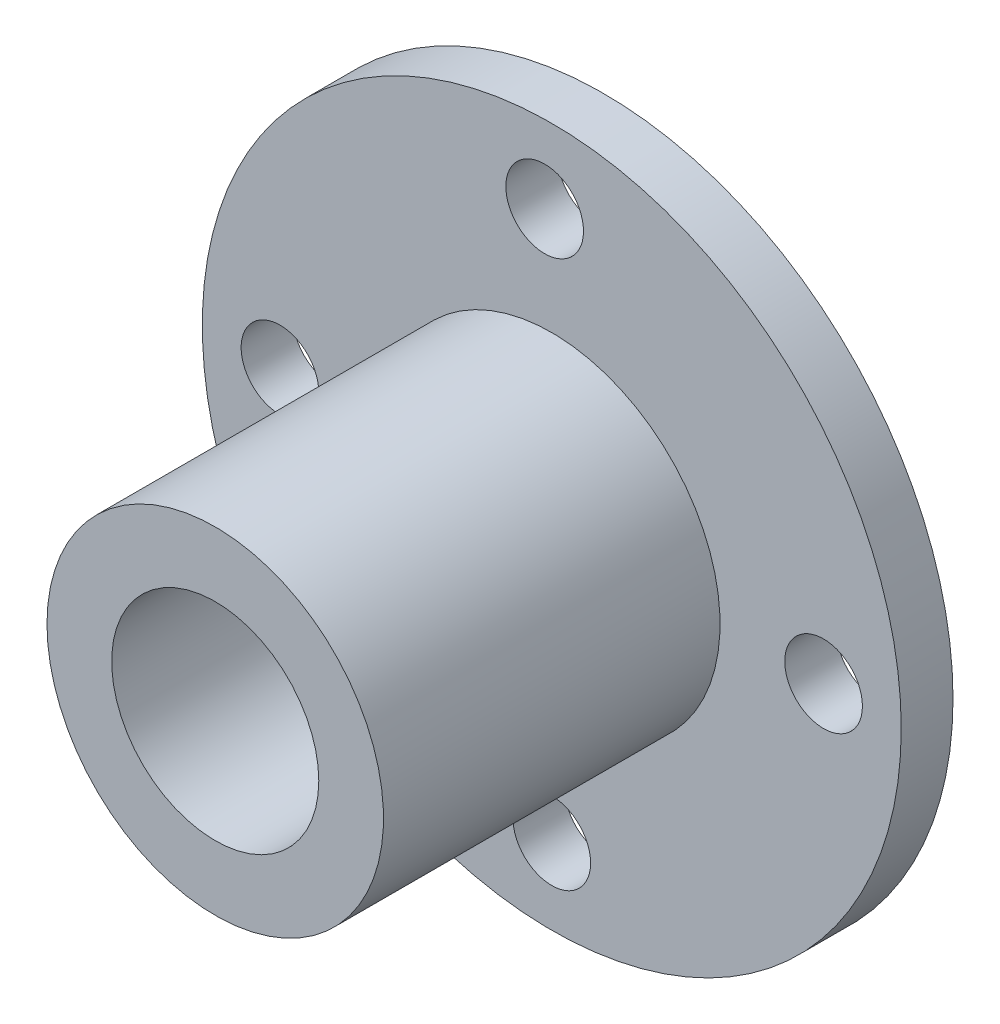
ISO-10303-21;
HEADER;
FILE_DESCRIPTION(('STEP AP214'),'2;1');
FILE_NAME('part.step','',(''),(''),'','','');
FILE_SCHEMA(('AUTOMOTIVE_DESIGN { 1 0 10303 214 1 1 1 1 }'));
ENDSEC;
DATA;
#1=APPLICATION_CONTEXT('core data for automotive mechanical design processes');
#2=APPLICATION_PROTOCOL_DEFINITION('international standard','automotive_design',2000,#1);
#3=PRODUCT_CONTEXT('',#1,'mechanical');
#4=PRODUCT('Part','Part','',(#3));
#5=PRODUCT_RELATED_PRODUCT_CATEGORY('part','',(#4));
#6=PRODUCT_DEFINITION_FORMATION('','',#4);
#7=PRODUCT_DEFINITION_CONTEXT('part definition',#1,'design');
#8=PRODUCT_DEFINITION('design','',#6,#7);
#9=PRODUCT_DEFINITION_SHAPE('','',#8);
#10=(LENGTH_UNIT() NAMED_UNIT(*) SI_UNIT(.MILLI.,.METRE.));
#11=(NAMED_UNIT(*) PLANE_ANGLE_UNIT() SI_UNIT($,.RADIAN.));
#12=(NAMED_UNIT(*) SI_UNIT($,.STERADIAN.) SOLID_ANGLE_UNIT());
#13=UNCERTAINTY_MEASURE_WITH_UNIT(LENGTH_MEASURE(1.E-05),#10,'distance_accuracy_value','');
#14=(GEOMETRIC_REPRESENTATION_CONTEXT(3) GLOBAL_UNCERTAINTY_ASSIGNED_CONTEXT((#13)) GLOBAL_UNIT_ASSIGNED_CONTEXT((#10,
#11,#12)) REPRESENTATION_CONTEXT('',''));
#15=CARTESIAN_POINT('',(0.,0.,0.));
#16=DIRECTION('',(0.,0.,1.));
#17=DIRECTION('',(1.,0.,0.));
#18=AXIS2_PLACEMENT_3D('',#15,#16,#17);
#19=CARTESIAN_POINT('',(0.,0.,2.));
#20=DIRECTION('',(0.,0.,-1.));
#21=DIRECTION('',(-1.,0.,0.));
#22=AXIS2_PLACEMENT_3D('',#19,#20,#21);
#23=CYLINDRICAL_SURFACE('',#22,13.5);
#24=CARTESIAN_POINT('',(0.,0.,2.));
#25=DIRECTION('',(0.,0.,1.));
#26=DIRECTION('',(1.,0.,0.));
#27=AXIS2_PLACEMENT_3D('',#24,#25,#26);
#28=CIRCLE('',#27,13.5);
#29=CARTESIAN_POINT('',(13.5,0.,2.));
#30=VERTEX_POINT('',#29);
#31=EDGE_CURVE('E50',#30,#30,#28,.T.);
#32=ORIENTED_EDGE('',*,*,#31,.F.);
#33=EDGE_LOOP('',(#32));
#34=FACE_BOUND('',#33,.T.);
#35=CARTESIAN_POINT('',(0.,0.,0.));
#36=DIRECTION('',(0.,0.,1.));
#37=DIRECTION('',(1.,0.,0.));
#38=AXIS2_PLACEMENT_3D('',#35,#36,#37);
#39=CIRCLE('',#38,13.5);
#40=CARTESIAN_POINT('',(13.5,0.,0.));
#41=VERTEX_POINT('',#40);
#42=EDGE_CURVE('E55',#41,#41,#39,.T.);
#43=ORIENTED_EDGE('',*,*,#42,.T.);
#44=EDGE_LOOP('',(#43));
#45=FACE_BOUND('',#44,.T.);
#46=ADVANCED_FACE('F43',(#34,#45),#23,.T.);
#47=CARTESIAN_POINT('',(0.,0.,2.));
#48=DIRECTION('',(0.,0.,1.));
#49=DIRECTION('',(1.,0.,0.));
#50=AXIS2_PLACEMENT_3D('',#47,#48,#49);
#51=PLANE('',#50);
#52=CARTESIAN_POINT('',(-10.5,0.,2.));
#53=DIRECTION('',(0.,0.,1.));
#54=DIRECTION('',(1.,0.,0.));
#55=AXIS2_PLACEMENT_3D('',#52,#53,#54);
#56=CIRCLE('',#55,1.5);
#57=CARTESIAN_POINT('',(-9.,0.,2.));
#58=VERTEX_POINT('',#57);
#59=EDGE_CURVE('E67',#58,#58,#56,.T.);
#60=ORIENTED_EDGE('',*,*,#59,.F.);
#61=EDGE_LOOP('',(#60));
#62=FACE_BOUND('',#61,.T.);
#63=CARTESIAN_POINT('',(-0.274707958544668,10.5,2.));
#64=DIRECTION('',(0.,0.,1.));
#65=DIRECTION('',(1.,0.,0.));
#66=AXIS2_PLACEMENT_3D('',#63,#64,#65);
#67=CIRCLE('',#66,1.5);
#68=CARTESIAN_POINT('',(1.22529204145533,10.5,2.));
#69=VERTEX_POINT('',#68);
#70=EDGE_CURVE('E90',#69,#69,#67,.T.);
#71=ORIENTED_EDGE('',*,*,#70,.F.);
#72=EDGE_LOOP('',(#71));
#73=FACE_BOUND('',#72,.T.);
#74=CARTESIAN_POINT('',(10.5,0.,2.));
#75=DIRECTION('',(0.,0.,1.));
#76=DIRECTION('',(1.,0.,0.));
#77=AXIS2_PLACEMENT_3D('',#74,#75,#76);
#78=CIRCLE('',#77,1.5);
#79=CARTESIAN_POINT('',(12.,0.,2.));
#80=VERTEX_POINT('',#79);
#81=EDGE_CURVE('E87',#80,#80,#78,.T.);
#82=ORIENTED_EDGE('',*,*,#81,.F.);
#83=EDGE_LOOP('',(#82));
#84=FACE_BOUND('',#83,.T.);
#85=CARTESIAN_POINT('',(0.,-10.5,2.));
#86=DIRECTION('',(0.,0.,1.));
#87=DIRECTION('',(1.,0.,0.));
#88=AXIS2_PLACEMENT_3D('',#85,#86,#87);
#89=CIRCLE('',#88,1.5);
#90=CARTESIAN_POINT('',(1.5,-10.5,2.));
#91=VERTEX_POINT('',#90);
#92=EDGE_CURVE('E84',#91,#91,#89,.T.);
#93=ORIENTED_EDGE('',*,*,#92,.F.);
#94=EDGE_LOOP('',(#93));
#95=FACE_BOUND('',#94,.T.);
#96=CARTESIAN_POINT('',(0.,0.,2.));
#97=DIRECTION('',(0.,0.,1.));
#98=DIRECTION('',(1.,0.,0.));
#99=AXIS2_PLACEMENT_3D('',#96,#97,#98);
#100=CIRCLE('',#99,6.5);
#101=CARTESIAN_POINT('',(-6.5,0.,2.));
#102=VERTEX_POINT('',#101);
#103=EDGE_CURVE('E10',#102,#102,#100,.T.);
#104=ORIENTED_EDGE('',*,*,#103,.F.);
#105=EDGE_LOOP('',(#104));
#106=FACE_BOUND('',#105,.T.);
#107=ORIENTED_EDGE('',*,*,#31,.T.);
#108=EDGE_LOOP('',(#107));
#109=FACE_BOUND('',#108,.T.);
#110=ADVANCED_FACE('F99',(#62,#73,#84,#95,#106,#109),#51,.T.);
#111=CARTESIAN_POINT('',(0.,0.,0.));
#112=DIRECTION('',(0.,0.,1.));
#113=DIRECTION('',(1.,0.,0.));
#114=AXIS2_PLACEMENT_3D('',#111,#112,#113);
#115=PLANE('',#114);
#116=CARTESIAN_POINT('',(-10.5,0.,0.));
#117=DIRECTION('',(0.,0.,1.));
#118=DIRECTION('',(1.,0.,0.));
#119=AXIS2_PLACEMENT_3D('',#116,#117,#118);
#120=CIRCLE('',#119,1.5);
#121=CARTESIAN_POINT('',(-9.,0.,0.));
#122=VERTEX_POINT('',#121);
#123=EDGE_CURVE('E46',#122,#122,#120,.T.);
#124=ORIENTED_EDGE('',*,*,#123,.T.);
#125=EDGE_LOOP('',(#124));
#126=FACE_BOUND('',#125,.T.);
#127=CARTESIAN_POINT('',(-0.274707958544668,10.5,0.));
#128=DIRECTION('',(0.,0.,1.));
#129=DIRECTION('',(1.,0.,0.));
#130=AXIS2_PLACEMENT_3D('',#127,#128,#129);
#131=CIRCLE('',#130,1.5);
#132=CARTESIAN_POINT('',(1.22529204145533,10.5,0.));
#133=VERTEX_POINT('',#132);
#134=EDGE_CURVE('E69',#133,#133,#131,.T.);
#135=ORIENTED_EDGE('',*,*,#134,.T.);
#136=EDGE_LOOP('',(#135));
#137=FACE_BOUND('',#136,.T.);
#138=CARTESIAN_POINT('',(10.5,0.,0.));
#139=DIRECTION('',(0.,0.,1.));
#140=DIRECTION('',(1.,0.,0.));
#141=AXIS2_PLACEMENT_3D('',#138,#139,#140);
#142=CIRCLE('',#141,1.5);
#143=CARTESIAN_POINT('',(12.,0.,0.));
#144=VERTEX_POINT('',#143);
#145=EDGE_CURVE('E66',#144,#144,#142,.T.);
#146=ORIENTED_EDGE('',*,*,#145,.T.);
#147=EDGE_LOOP('',(#146));
#148=FACE_BOUND('',#147,.T.);
#149=CARTESIAN_POINT('',(0.,-10.5,0.));
#150=DIRECTION('',(0.,0.,1.));
#151=DIRECTION('',(1.,0.,0.));
#152=AXIS2_PLACEMENT_3D('',#149,#150,#151);
#153=CIRCLE('',#152,1.5);
#154=CARTESIAN_POINT('',(1.5,-10.5,0.));
#155=VERTEX_POINT('',#154);
#156=EDGE_CURVE('E63',#155,#155,#153,.T.);
#157=ORIENTED_EDGE('',*,*,#156,.T.);
#158=EDGE_LOOP('',(#157));
#159=FACE_BOUND('',#158,.T.);
#160=CARTESIAN_POINT('',(0.,0.,0.));
#161=DIRECTION('',(0.,0.,1.));
#162=DIRECTION('',(1.,0.,0.));
#163=AXIS2_PLACEMENT_3D('',#160,#161,#162);
#164=CIRCLE('',#163,4.);
#165=CARTESIAN_POINT('',(4.,0.,0.));
#166=VERTEX_POINT('',#165);
#167=EDGE_CURVE('E78',#166,#166,#164,.T.);
#168=ORIENTED_EDGE('',*,*,#167,.T.);
#169=EDGE_LOOP('',(#168));
#170=FACE_BOUND('',#169,.T.);
#171=ORIENTED_EDGE('',*,*,#42,.F.);
#172=EDGE_LOOP('',(#171));
#173=FACE_BOUND('',#172,.T.);
#174=ADVANCED_FACE('F102',(#126,#137,#148,#159,#170,#173),#115,.F.);
#175=CARTESIAN_POINT('',(0.,0.,15.));
#176=DIRECTION('',(0.,0.,-1.));
#177=DIRECTION('',(-1.,0.,0.));
#178=AXIS2_PLACEMENT_3D('',#175,#176,#177);
#179=CYLINDRICAL_SURFACE('',#178,6.5);
#180=CARTESIAN_POINT('',(0.,0.,15.));
#181=DIRECTION('',(0.,0.,1.));
#182=DIRECTION('',(1.,0.,0.));
#183=AXIS2_PLACEMENT_3D('',#180,#181,#182);
#184=CIRCLE('',#183,6.5);
#185=CARTESIAN_POINT('',(-6.5,0.,15.));
#186=VERTEX_POINT('',#185);
#187=EDGE_CURVE('E58',#186,#186,#184,.T.);
#188=CARTESIAN_POINT('',(-6.5,0.,15.));
#189=CARTESIAN_POINT('',(-6.5,0.,14.8645833333333));
#190=CARTESIAN_POINT('',(-6.5,0.,14.7291666666667));
#191=CARTESIAN_POINT('',(-6.5,0.,14.4583333333333));
#192=CARTESIAN_POINT('',(-6.5,0.,14.3229166666667));
#193=CARTESIAN_POINT('',(-6.5,0.,14.0520833333333));
#194=CARTESIAN_POINT('',(-6.5,0.,13.9166666666667));
#195=CARTESIAN_POINT('',(-6.5,0.,13.6458333333333));
#196=CARTESIAN_POINT('',(-6.5,0.,13.5104166666667));
#197=CARTESIAN_POINT('',(-6.5,0.,13.2395833333333));
#198=CARTESIAN_POINT('',(-6.5,0.,13.1041666666667));
#199=CARTESIAN_POINT('',(-6.5,0.,12.8333333333333));
#200=CARTESIAN_POINT('',(-6.5,0.,12.6979166666667));
#201=CARTESIAN_POINT('',(-6.5,0.,12.4270833333333));
#202=CARTESIAN_POINT('',(-6.5,0.,12.2916666666667));
#203=CARTESIAN_POINT('',(-6.5,0.,12.0208333333333));
#204=CARTESIAN_POINT('',(-6.5,0.,11.8854166666667));
#205=CARTESIAN_POINT('',(-6.5,0.,11.6145833333333));
#206=CARTESIAN_POINT('',(-6.5,0.,11.4791666666667));
#207=CARTESIAN_POINT('',(-6.5,0.,11.2083333333333));
#208=CARTESIAN_POINT('',(-6.5,0.,11.0729166666667));
#209=CARTESIAN_POINT('',(-6.5,0.,10.8020833333333));
#210=CARTESIAN_POINT('',(-6.5,0.,10.6666666666667));
#211=CARTESIAN_POINT('',(-6.5,0.,10.3958333333333));
#212=CARTESIAN_POINT('',(-6.5,0.,10.2604166666667));
#213=CARTESIAN_POINT('',(-6.5,0.,9.98958333333333));
#214=CARTESIAN_POINT('',(-6.5,0.,9.85416666666667));
#215=CARTESIAN_POINT('',(-6.5,0.,9.58333333333333));
#216=CARTESIAN_POINT('',(-6.5,0.,9.44791666666667));
#217=CARTESIAN_POINT('',(-6.5,0.,9.17708333333333));
#218=CARTESIAN_POINT('',(-6.5,0.,9.04166666666667));
#219=CARTESIAN_POINT('',(-6.5,0.,8.77083333333333));
#220=CARTESIAN_POINT('',(-6.5,0.,8.63541666666667));
#221=CARTESIAN_POINT('',(-6.5,0.,8.36458333333333));
#222=CARTESIAN_POINT('',(-6.5,0.,8.22916666666667));
#223=CARTESIAN_POINT('',(-6.5,0.,7.95833333333333));
#224=CARTESIAN_POINT('',(-6.5,0.,7.82291666666667));
#225=CARTESIAN_POINT('',(-6.5,0.,7.55208333333333));
#226=CARTESIAN_POINT('',(-6.5,0.,7.41666666666667));
#227=CARTESIAN_POINT('',(-6.5,0.,7.14583333333333));
#228=CARTESIAN_POINT('',(-6.5,0.,7.01041666666667));
#229=CARTESIAN_POINT('',(-6.5,0.,6.73958333333333));
#230=CARTESIAN_POINT('',(-6.5,0.,6.60416666666667));
#231=CARTESIAN_POINT('',(-6.5,0.,6.33333333333333));
#232=CARTESIAN_POINT('',(-6.5,0.,6.19791666666667));
#233=CARTESIAN_POINT('',(-6.5,0.,5.92708333333333));
#234=CARTESIAN_POINT('',(-6.5,0.,5.79166666666667));
#235=CARTESIAN_POINT('',(-6.5,0.,5.52083333333333));
#236=CARTESIAN_POINT('',(-6.5,0.,5.38541666666667));
#237=CARTESIAN_POINT('',(-6.5,0.,5.11458333333333));
#238=CARTESIAN_POINT('',(-6.5,0.,4.97916666666667));
#239=CARTESIAN_POINT('',(-6.5,0.,4.70833333333333));
#240=CARTESIAN_POINT('',(-6.5,0.,4.57291666666667));
#241=CARTESIAN_POINT('',(-6.5,0.,4.30208333333333));
#242=CARTESIAN_POINT('',(-6.5,0.,4.16666666666667));
#243=CARTESIAN_POINT('',(-6.5,0.,3.89583333333333));
#244=CARTESIAN_POINT('',(-6.5,0.,3.76041666666667));
#245=CARTESIAN_POINT('',(-6.5,0.,3.48958333333333));
#246=CARTESIAN_POINT('',(-6.5,0.,3.35416666666667));
#247=CARTESIAN_POINT('',(-6.5,0.,3.08333333333333));
#248=CARTESIAN_POINT('',(-6.5,0.,2.94791666666667));
#249=CARTESIAN_POINT('',(-6.5,0.,2.67708333333333));
#250=CARTESIAN_POINT('',(-6.5,0.,2.54166666666667));
#251=CARTESIAN_POINT('',(-6.5,0.,2.27083333333333));
#252=CARTESIAN_POINT('',(-6.5,0.,2.13541666666667));
#253=CARTESIAN_POINT('',(-6.5,0.,2.));
#254=B_SPLINE_CURVE_WITH_KNOTS('',3,(#188,#189,#190,#191,#192,#193,#194,#195,#196,#197,#198,
#199,#200,#201,#202,#203,#204,#205,#206,#207,#208,#209,#210,#211,#212,#213,#214,#215,#216,#217,
#218,#219,#220,#221,#222,#223,#224,#225,#226,#227,#228,#229,#230,#231,#232,#233,#234,#235,#236,
#237,#238,#239,#240,#241,#242,#243,#244,#245,#246,#247,#248,#249,#250,#251,#252,#253),
.UNSPECIFIED.,.F.,.F.,(4,2,2,2,2,2,2,2,2,2,2,2,2,2,2,2,2,2,2,2,2,2,2,2,2,2,2,2,2,2,2,2,4),(0.,
0.406249999999999,0.812499999999999,1.21875,1.625,2.03125,2.4375,2.84375,3.25,3.65625,4.0625,
4.46875,4.875,5.28125,5.6875,6.09375,6.5,6.90625,7.3125,7.71875,8.125,8.53125,8.9375,9.34375,
9.75,10.15625,10.5625,10.96875,11.375,11.78125,12.1875,12.59375,13.),.UNSPECIFIED.);
#255=EDGE_CURVE('BSEAM118',#186,#102,#254,.T.);
#256=ORIENTED_EDGE('',*,*,#187,.F.);
#257=ORIENTED_EDGE('',*,*,#103,.T.);
#258=ORIENTED_EDGE('',*,*,#255,.T.);
#259=ORIENTED_EDGE('',*,*,#255,.F.);
#260=EDGE_LOOP('',(#256,#258,#257,#259));
#261=FACE_BOUND('',#260,.T.);
#262=ADVANCED_FACE('F118',(#261),#179,.T.);
#263=CARTESIAN_POINT('',(0.,0.,15.));
#264=DIRECTION('',(0.,0.,1.));
#265=DIRECTION('',(1.,0.,0.));
#266=AXIS2_PLACEMENT_3D('',#263,#264,#265);
#267=PLANE('',#266);
#268=CARTESIAN_POINT('',(0.,0.,15.));
#269=DIRECTION('',(0.,0.,1.));
#270=DIRECTION('',(1.,0.,0.));
#271=AXIS2_PLACEMENT_3D('',#268,#269,#270);
#272=CIRCLE('',#271,4.);
#273=CARTESIAN_POINT('',(4.,0.,15.));
#274=VERTEX_POINT('',#273);
#275=EDGE_CURVE('E74',#274,#274,#272,.T.);
#276=ORIENTED_EDGE('',*,*,#275,.F.);
#277=EDGE_LOOP('',(#276));
#278=FACE_BOUND('',#277,.T.);
#279=ORIENTED_EDGE('',*,*,#187,.T.);
#280=EDGE_LOOP('',(#279));
#281=FACE_BOUND('',#280,.T.);
#282=ADVANCED_FACE('F123',(#278,#281),#267,.T.);
#283=CARTESIAN_POINT('',(0.,0.,0.));
#284=DIRECTION('',(0.,0.,1.));
#285=DIRECTION('',(1.,0.,0.));
#286=AXIS2_PLACEMENT_3D('',#283,#284,#285);
#287=CYLINDRICAL_SURFACE('',#286,4.);
#288=ORIENTED_EDGE('',*,*,#167,.F.);
#289=EDGE_LOOP('',(#288));
#290=FACE_BOUND('',#289,.T.);
#291=ORIENTED_EDGE('',*,*,#275,.T.);
#292=EDGE_LOOP('',(#291));
#293=FACE_BOUND('',#292,.T.);
#294=ADVANCED_FACE('F129',(#290,#293),#287,.F.);
#295=CARTESIAN_POINT('',(0.,-10.5,-13.));
#296=DIRECTION('',(0.,0.,1.));
#297=DIRECTION('',(1.,0.,0.));
#298=AXIS2_PLACEMENT_3D('',#295,#296,#297);
#299=CYLINDRICAL_SURFACE('',#298,1.5);
#300=ORIENTED_EDGE('',*,*,#92,.T.);
#301=EDGE_LOOP('',(#300));
#302=FACE_BOUND('',#301,.T.);
#303=ORIENTED_EDGE('',*,*,#156,.F.);
#304=EDGE_LOOP('',(#303));
#305=FACE_BOUND('',#304,.T.);
#306=ADVANCED_FACE('F133',(#302,#305),#299,.F.);
#307=CARTESIAN_POINT('',(10.5,0.,-13.));
#308=DIRECTION('',(0.,0.,1.));
#309=DIRECTION('',(1.,0.,0.));
#310=AXIS2_PLACEMENT_3D('',#307,#308,#309);
#311=CYLINDRICAL_SURFACE('',#310,1.5);
#312=ORIENTED_EDGE('',*,*,#81,.T.);
#313=EDGE_LOOP('',(#312));
#314=FACE_BOUND('',#313,.T.);
#315=ORIENTED_EDGE('',*,*,#145,.F.);
#316=EDGE_LOOP('',(#315));
#317=FACE_BOUND('',#316,.T.);
#318=ADVANCED_FACE('F136',(#314,#317),#311,.F.);
#319=CARTESIAN_POINT('',(-0.274707958544668,10.5,-13.));
#320=DIRECTION('',(0.,0.,1.));
#321=DIRECTION('',(1.,0.,0.));
#322=AXIS2_PLACEMENT_3D('',#319,#320,#321);
#323=CYLINDRICAL_SURFACE('',#322,1.5);
#324=ORIENTED_EDGE('',*,*,#70,.T.);
#325=EDGE_LOOP('',(#324));
#326=FACE_BOUND('',#325,.T.);
#327=ORIENTED_EDGE('',*,*,#134,.F.);
#328=EDGE_LOOP('',(#327));
#329=FACE_BOUND('',#328,.T.);
#330=ADVANCED_FACE('F140',(#326,#329),#323,.F.);
#331=CARTESIAN_POINT('',(-10.5,0.,-13.));
#332=DIRECTION('',(0.,0.,1.));
#333=DIRECTION('',(1.,0.,0.));
#334=AXIS2_PLACEMENT_3D('',#331,#332,#333);
#335=CYLINDRICAL_SURFACE('',#334,1.5);
#336=ORIENTED_EDGE('',*,*,#59,.T.);
#337=EDGE_LOOP('',(#336));
#338=FACE_BOUND('',#337,.T.);
#339=ORIENTED_EDGE('',*,*,#123,.F.);
#340=EDGE_LOOP('',(#339));
#341=FACE_BOUND('',#340,.T.);
#342=ADVANCED_FACE('F96',(#338,#341),#335,.F.);
#343=CLOSED_SHELL('',(#46,#110,#174,#262,#282,#294,#306,#318,#330,#342));
#344=MANIFOLD_SOLID_BREP('B2',#343);
#345=ADVANCED_BREP_SHAPE_REPRESENTATION('',(#18,#344),#14);
#346=SHAPE_DEFINITION_REPRESENTATION(#9,#345);
ENDSEC;
END-ISO-10303-21;
